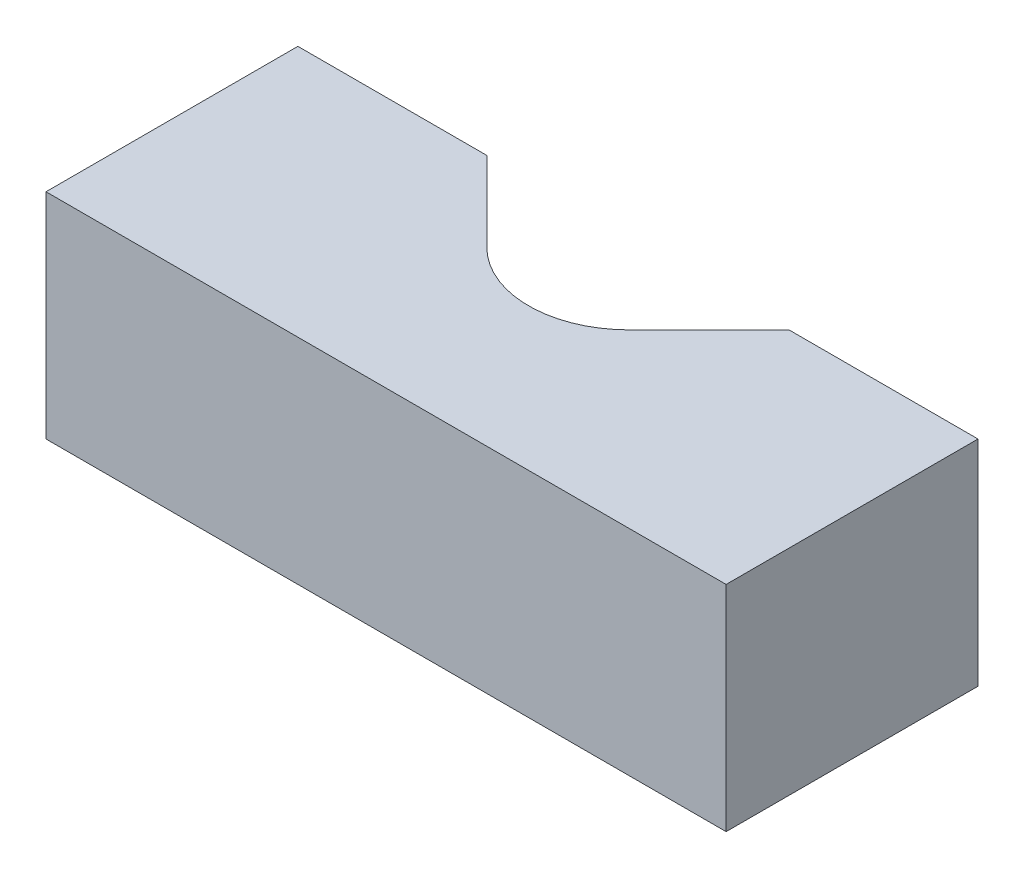
ISO-10303-21;
HEADER;
FILE_DESCRIPTION(('STEP AP214'),'2;1');
FILE_NAME('part.step','',(''),(''),'','','');
FILE_SCHEMA(('AUTOMOTIVE_DESIGN { 1 0 10303 214 1 1 1 1 }'));
ENDSEC;
DATA;
#1=APPLICATION_CONTEXT('core data for automotive mechanical design processes');
#2=APPLICATION_PROTOCOL_DEFINITION('international standard','automotive_design',2000,#1);
#3=PRODUCT_CONTEXT('',#1,'mechanical');
#4=PRODUCT('Part','Part','',(#3));
#5=PRODUCT_RELATED_PRODUCT_CATEGORY('part','',(#4));
#6=PRODUCT_DEFINITION_FORMATION('','',#4);
#7=PRODUCT_DEFINITION_CONTEXT('part definition',#1,'design');
#8=PRODUCT_DEFINITION('design','',#6,#7);
#9=PRODUCT_DEFINITION_SHAPE('','',#8);
#10=(LENGTH_UNIT() NAMED_UNIT(*) SI_UNIT(.MILLI.,.METRE.));
#11=(NAMED_UNIT(*) PLANE_ANGLE_UNIT() SI_UNIT($,.RADIAN.));
#12=(NAMED_UNIT(*) SI_UNIT($,.STERADIAN.) SOLID_ANGLE_UNIT());
#13=UNCERTAINTY_MEASURE_WITH_UNIT(LENGTH_MEASURE(1.E-05),#10,'distance_accuracy_value','');
#14=(GEOMETRIC_REPRESENTATION_CONTEXT(3) GLOBAL_UNCERTAINTY_ASSIGNED_CONTEXT((#13)) GLOBAL_UNIT_ASSIGNED_CONTEXT((#10,
#11,#12)) REPRESENTATION_CONTEXT('',''));
#15=CARTESIAN_POINT('',(0.,0.,0.));
#16=DIRECTION('',(0.,0.,1.));
#17=DIRECTION('',(1.,0.,0.));
#18=AXIS2_PLACEMENT_3D('',#15,#16,#17);
#19=CARTESIAN_POINT('',(7.6179007312484,10.795,1.524));
#20=DIRECTION('',(0.,0.,1.));
#21=DIRECTION('',(1.,0.,0.));
#22=AXIS2_PLACEMENT_3D('',#19,#20,#21);
#23=PLANE('',#22);
#24=DIRECTION('',(-1.,0.,0.));
#25=VECTOR('',#24,1.);
#26=CARTESIAN_POINT('',(7.6179007312484,0.,1.524));
#27=LINE('',#26,#25);
#28=CARTESIAN_POINT('',(17.1429007312484,0.,1.524));
#29=VERTEX_POINT('',#28);
#30=CARTESIAN_POINT('',(7.6179007312484,0.,1.524));
#31=VERTEX_POINT('',#30);
#32=EDGE_CURVE('E119',#29,#31,#27,.T.);
#33=ORIENTED_EDGE('',*,*,#32,.T.);
#34=DIRECTION('',(0.,-1.,0.));
#35=VECTOR('',#34,1.);
#36=CARTESIAN_POINT('',(7.6179007312484,10.795,1.524));
#37=LINE('',#36,#35);
#38=CARTESIAN_POINT('',(7.6179007312484,10.795,1.524));
#39=VERTEX_POINT('',#38);
#40=EDGE_CURVE('E102',#39,#31,#37,.T.);
#41=ORIENTED_EDGE('',*,*,#40,.F.);
#42=DIRECTION('',(-1.,0.,0.));
#43=VECTOR('',#42,1.);
#44=CARTESIAN_POINT('',(7.6179007312484,10.795,1.524));
#45=LINE('',#44,#43);
#46=CARTESIAN_POINT('',(17.1429007312484,10.795,1.524));
#47=VERTEX_POINT('',#46);
#48=EDGE_CURVE('E107',#47,#39,#45,.T.);
#49=ORIENTED_EDGE('',*,*,#48,.F.);
#50=DIRECTION('',(0.,-1.,0.));
#51=VECTOR('',#50,1.);
#52=CARTESIAN_POINT('',(17.1429007312484,10.795,1.524));
#53=LINE('',#52,#51);
#54=EDGE_CURVE('E138',#47,#29,#53,.T.);
#55=ORIENTED_EDGE('',*,*,#54,.T.);
#56=EDGE_LOOP('',(#33,#41,#49,#55));
#57=FACE_BOUND('',#56,.T.);
#58=ADVANCED_FACE('F37',(#57),#23,.F.);
#59=CARTESIAN_POINT('',(7.6179007312484,10.795,1.524));
#60=DIRECTION('',(0.707106781186548,0.,0.707106781186547));
#61=DIRECTION('',(0.707106781186547,0.,-0.707106781186548));
#62=AXIS2_PLACEMENT_3D('',#59,#60,#61);
#63=PLANE('',#62);
#64=DIRECTION('',(-0.707106781186547,0.,0.707106781186548));
#65=VECTOR('',#64,1.);
#66=CARTESIAN_POINT('',(7.6179007312484,0.,1.524));
#67=LINE('',#66,#65);
#68=CARTESIAN_POINT('',(3.59210244842766,0.,5.54979828282074));
#69=VERTEX_POINT('',#68);
#70=EDGE_CURVE('E149',#31,#69,#67,.T.);
#71=ORIENTED_EDGE('',*,*,#70,.T.);
#72=DIRECTION('',(0.,-1.,0.));
#73=VECTOR('',#72,1.);
#74=CARTESIAN_POINT('',(3.59210244842766,10.795,5.54979828282074));
#75=LINE('',#74,#73);
#76=CARTESIAN_POINT('',(3.59210244842766,10.795,5.54979828282074));
#77=VERTEX_POINT('',#76);
#78=EDGE_CURVE('E52',#69,#77,#75,.F.);
#79=ORIENTED_EDGE('',*,*,#78,.T.);
#80=DIRECTION('',(-0.707106781186547,0.,0.707106781186548));
#81=VECTOR('',#80,1.);
#82=CARTESIAN_POINT('',(7.6179007312484,10.795,1.524));
#83=LINE('',#82,#81);
#84=EDGE_CURVE('E98',#39,#77,#83,.T.);
#85=ORIENTED_EDGE('',*,*,#84,.F.);
#86=ORIENTED_EDGE('',*,*,#40,.T.);
#87=EDGE_LOOP('',(#71,#79,#85,#86));
#88=FACE_BOUND('',#87,.T.);
#89=ADVANCED_FACE('F100',(#88),#63,.F.);
#90=CARTESIAN_POINT('',(-7.6179007312484,10.795,1.524));
#91=DIRECTION('',(-0.707106781186547,0.,0.707106781186548));
#92=DIRECTION('',(0.707106781186548,0.,0.707106781186547));
#93=AXIS2_PLACEMENT_3D('',#90,#91,#92);
#94=PLANE('',#93);
#95=DIRECTION('',(-0.707106781186548,0.,-0.707106781186547));
#96=VECTOR('',#95,1.);
#97=CARTESIAN_POINT('',(-7.6179007312484,10.795,1.524));
#98=LINE('',#97,#96);
#99=CARTESIAN_POINT('',(-3.59210244842766,10.795,5.54979828282074));
#100=VERTEX_POINT('',#99);
#101=CARTESIAN_POINT('',(-7.6179007312484,10.795,1.524));
#102=VERTEX_POINT('',#101);
#103=EDGE_CURVE('E106',#100,#102,#98,.T.);
#104=ORIENTED_EDGE('',*,*,#103,.F.);
#105=DIRECTION('',(0.,-1.,0.));
#106=VECTOR('',#105,1.);
#107=CARTESIAN_POINT('',(-3.59210244842766,0.,5.54979828282074));
#108=LINE('',#107,#106);
#109=CARTESIAN_POINT('',(-3.59210244842766,0.,5.54979828282074));
#110=VERTEX_POINT('',#109);
#111=EDGE_CURVE('E120',#100,#110,#108,.T.);
#112=ORIENTED_EDGE('',*,*,#111,.T.);
#113=DIRECTION('',(-0.707106781186548,0.,-0.707106781186547));
#114=VECTOR('',#113,1.);
#115=CARTESIAN_POINT('',(-7.6179007312484,0.,1.524));
#116=LINE('',#115,#114);
#117=CARTESIAN_POINT('',(-7.6179007312484,0.,1.524));
#118=VERTEX_POINT('',#117);
#119=EDGE_CURVE('E147',#110,#118,#116,.T.);
#120=ORIENTED_EDGE('',*,*,#119,.T.);
#121=DIRECTION('',(0.,-1.,0.));
#122=VECTOR('',#121,1.);
#123=CARTESIAN_POINT('',(-7.6179007312484,10.795,1.524));
#124=LINE('',#123,#122);
#125=EDGE_CURVE('E121',#102,#118,#124,.T.);
#126=ORIENTED_EDGE('',*,*,#125,.F.);
#127=EDGE_LOOP('',(#104,#112,#120,#126));
#128=FACE_BOUND('',#127,.T.);
#129=ADVANCED_FACE('F165',(#128),#94,.F.);
#130=CARTESIAN_POINT('',(-7.6179007312484,10.795,1.524));
#131=DIRECTION('',(0.,0.,1.));
#132=DIRECTION('',(1.,0.,0.));
#133=AXIS2_PLACEMENT_3D('',#130,#131,#132);
#134=PLANE('',#133);
#135=DIRECTION('',(-1.,0.,0.));
#136=VECTOR('',#135,1.);
#137=CARTESIAN_POINT('',(-7.6179007312484,0.,1.524));
#138=LINE('',#137,#136);
#139=CARTESIAN_POINT('',(-17.1429007312484,0.,1.524));
#140=VERTEX_POINT('',#139);
#141=EDGE_CURVE('E145',#118,#140,#138,.T.);
#142=ORIENTED_EDGE('',*,*,#141,.T.);
#143=DIRECTION('',(0.,-1.,0.));
#144=VECTOR('',#143,1.);
#145=CARTESIAN_POINT('',(-17.1429007312484,10.795,1.524));
#146=LINE('',#145,#144);
#147=CARTESIAN_POINT('',(-17.1429007312484,10.795,1.524));
#148=VERTEX_POINT('',#147);
#149=EDGE_CURVE('E126',#148,#140,#146,.T.);
#150=ORIENTED_EDGE('',*,*,#149,.F.);
#151=DIRECTION('',(-1.,0.,0.));
#152=VECTOR('',#151,1.);
#153=CARTESIAN_POINT('',(-7.6179007312484,10.795,1.524));
#154=LINE('',#153,#152);
#155=EDGE_CURVE('E157',#102,#148,#154,.T.);
#156=ORIENTED_EDGE('',*,*,#155,.F.);
#157=ORIENTED_EDGE('',*,*,#125,.T.);
#158=EDGE_LOOP('',(#142,#150,#156,#157));
#159=FACE_BOUND('',#158,.T.);
#160=ADVANCED_FACE('F168',(#159),#134,.F.);
#161=CARTESIAN_POINT('',(-17.1429007312484,10.795,1.524));
#162=DIRECTION('',(1.,0.,0.));
#163=DIRECTION('',(0.,0.,-1.));
#164=AXIS2_PLACEMENT_3D('',#161,#162,#163);
#165=PLANE('',#164);
#166=DIRECTION('',(0.,0.,1.));
#167=VECTOR('',#166,1.);
#168=CARTESIAN_POINT('',(-17.1429007312484,0.,1.524));
#169=LINE('',#168,#167);
#170=CARTESIAN_POINT('',(-17.1429007312484,0.,14.2219007312484));
#171=VERTEX_POINT('',#170);
#172=EDGE_CURVE('E143',#140,#171,#169,.T.);
#173=ORIENTED_EDGE('',*,*,#172,.T.);
#174=DIRECTION('',(0.,-1.,0.));
#175=VECTOR('',#174,1.);
#176=CARTESIAN_POINT('',(-17.1429007312484,10.795,14.2219007312484));
#177=LINE('',#176,#175);
#178=CARTESIAN_POINT('',(-17.1429007312484,10.795,14.2219007312484));
#179=VERTEX_POINT('',#178);
#180=EDGE_CURVE('E132',#179,#171,#177,.T.);
#181=ORIENTED_EDGE('',*,*,#180,.F.);
#182=DIRECTION('',(0.,0.,1.));
#183=VECTOR('',#182,1.);
#184=CARTESIAN_POINT('',(-17.1429007312484,10.795,1.524));
#185=LINE('',#184,#183);
#186=EDGE_CURVE('E155',#148,#179,#185,.T.);
#187=ORIENTED_EDGE('',*,*,#186,.F.);
#188=ORIENTED_EDGE('',*,*,#149,.T.);
#189=EDGE_LOOP('',(#173,#181,#187,#188));
#190=FACE_BOUND('',#189,.T.);
#191=ADVANCED_FACE('F173',(#190),#165,.F.);
#192=CARTESIAN_POINT('',(-17.1429007312484,10.795,14.2219007312484));
#193=DIRECTION('',(0.,0.,-1.));
#194=DIRECTION('',(-1.,0.,0.));
#195=AXIS2_PLACEMENT_3D('',#192,#193,#194);
#196=PLANE('',#195);
#197=DIRECTION('',(1.,0.,0.));
#198=VECTOR('',#197,1.);
#199=CARTESIAN_POINT('',(-17.1429007312484,0.,14.2219007312484));
#200=LINE('',#199,#198);
#201=CARTESIAN_POINT('',(17.1429007312484,0.,14.2219007312484));
#202=VERTEX_POINT('',#201);
#203=EDGE_CURVE('E141',#171,#202,#200,.T.);
#204=ORIENTED_EDGE('',*,*,#203,.T.);
#205=DIRECTION('',(0.,-1.,0.));
#206=VECTOR('',#205,1.);
#207=CARTESIAN_POINT('',(17.1429007312484,10.795,14.2219007312484));
#208=LINE('',#207,#206);
#209=CARTESIAN_POINT('',(17.1429007312484,10.795,14.2219007312484));
#210=VERTEX_POINT('',#209);
#211=EDGE_CURVE('E135',#210,#202,#208,.T.);
#212=ORIENTED_EDGE('',*,*,#211,.F.);
#213=DIRECTION('',(1.,0.,0.));
#214=VECTOR('',#213,1.);
#215=CARTESIAN_POINT('',(-17.1429007312484,10.795,14.2219007312484));
#216=LINE('',#215,#214);
#217=EDGE_CURVE('E153',#179,#210,#216,.T.);
#218=ORIENTED_EDGE('',*,*,#217,.F.);
#219=ORIENTED_EDGE('',*,*,#180,.T.);
#220=EDGE_LOOP('',(#204,#212,#218,#219));
#221=FACE_BOUND('',#220,.T.);
#222=ADVANCED_FACE('F177',(#221),#196,.F.);
#223=CARTESIAN_POINT('',(17.1429007312484,10.795,1.524));
#224=DIRECTION('',(-1.,0.,0.));
#225=DIRECTION('',(0.,0.,1.));
#226=AXIS2_PLACEMENT_3D('',#223,#224,#225);
#227=PLANE('',#226);
#228=DIRECTION('',(0.,0.,-1.));
#229=VECTOR('',#228,1.);
#230=CARTESIAN_POINT('',(17.1429007312484,0.,1.524));
#231=LINE('',#230,#229);
#232=EDGE_CURVE('E116',#202,#29,#231,.T.);
#233=ORIENTED_EDGE('',*,*,#232,.T.);
#234=ORIENTED_EDGE('',*,*,#54,.F.);
#235=DIRECTION('',(0.,0.,-1.));
#236=VECTOR('',#235,1.);
#237=CARTESIAN_POINT('',(17.1429007312484,10.795,1.524));
#238=LINE('',#237,#236);
#239=EDGE_CURVE('E112',#210,#47,#238,.T.);
#240=ORIENTED_EDGE('',*,*,#239,.F.);
#241=ORIENTED_EDGE('',*,*,#211,.T.);
#242=EDGE_LOOP('',(#233,#234,#240,#241));
#243=FACE_BOUND('',#242,.T.);
#244=ADVANCED_FACE('F181',(#243),#227,.F.);
#245=CARTESIAN_POINT('',(0.,10.795,0.));
#246=DIRECTION('',(0.,-1.,0.));
#247=DIRECTION('',(0.,0.,-1.));
#248=AXIS2_PLACEMENT_3D('',#245,#246,#247);
#249=PLANE('',#248);
#250=ORIENTED_EDGE('',*,*,#48,.T.);
#251=ORIENTED_EDGE('',*,*,#84,.T.);
#252=CARTESIAN_POINT('',(0.,10.795,1.95769583439308));
#253=DIRECTION('',(0.,-1.,0.));
#254=DIRECTION('',(0.,0.,-1.));
#255=AXIS2_PLACEMENT_3D('',#252,#253,#254);
#256=CIRCLE('',#255,5.08);
#257=EDGE_CURVE('E11',#77,#100,#256,.T.);
#258=ORIENTED_EDGE('',*,*,#257,.T.);
#259=ORIENTED_EDGE('',*,*,#103,.T.);
#260=ORIENTED_EDGE('',*,*,#155,.T.);
#261=ORIENTED_EDGE('',*,*,#186,.T.);
#262=ORIENTED_EDGE('',*,*,#217,.T.);
#263=ORIENTED_EDGE('',*,*,#239,.T.);
#264=EDGE_LOOP('',(#250,#251,#258,#259,#260,#261,#262,#263));
#265=FACE_BOUND('',#264,.T.);
#266=ADVANCED_FACE('F110',(#265),#249,.F.);
#267=CARTESIAN_POINT('',(0.,0.,0.));
#268=DIRECTION('',(0.,-1.,0.));
#269=DIRECTION('',(0.,0.,-1.));
#270=AXIS2_PLACEMENT_3D('',#267,#268,#269);
#271=PLANE('',#270);
#272=ORIENTED_EDGE('',*,*,#32,.F.);
#273=ORIENTED_EDGE('',*,*,#232,.F.);
#274=ORIENTED_EDGE('',*,*,#203,.F.);
#275=ORIENTED_EDGE('',*,*,#172,.F.);
#276=ORIENTED_EDGE('',*,*,#141,.F.);
#277=ORIENTED_EDGE('',*,*,#119,.F.);
#278=CARTESIAN_POINT('',(0.,0.,1.95769583439308));
#279=DIRECTION('',(0.,-1.,0.));
#280=DIRECTION('',(0.,0.,-1.));
#281=AXIS2_PLACEMENT_3D('',#278,#279,#280);
#282=CIRCLE('',#281,5.08);
#283=EDGE_CURVE('E45',#110,#69,#282,.F.);
#284=ORIENTED_EDGE('',*,*,#283,.T.);
#285=ORIENTED_EDGE('',*,*,#70,.F.);
#286=EDGE_LOOP('',(#272,#273,#274,#275,#276,#277,#284,#285));
#287=FACE_BOUND('',#286,.T.);
#288=ADVANCED_FACE('F182',(#287),#271,.T.);
#289=CARTESIAN_POINT('',(0.,10.795,1.95769583439308));
#290=DIRECTION('',(0.,1.,0.));
#291=DIRECTION('',(0.,0.,1.));
#292=AXIS2_PLACEMENT_3D('',#289,#290,#291);
#293=CYLINDRICAL_SURFACE('',#292,5.08);
#294=ORIENTED_EDGE('',*,*,#257,.F.);
#295=ORIENTED_EDGE('',*,*,#78,.F.);
#296=ORIENTED_EDGE('',*,*,#283,.F.);
#297=ORIENTED_EDGE('',*,*,#111,.F.);
#298=EDGE_LOOP('',(#294,#295,#296,#297));
#299=FACE_BOUND('',#298,.T.);
#300=ADVANCED_FACE('F39',(#299),#293,.F.);
#301=CLOSED_SHELL('',(#58,#89,#129,#160,#191,#222,#244,#266,#288,#300));
#302=MANIFOLD_SOLID_BREP('B2',#301);
#303=ADVANCED_BREP_SHAPE_REPRESENTATION('',(#18,#302),#14);
#304=SHAPE_DEFINITION_REPRESENTATION(#9,#303);
ENDSEC;
END-ISO-10303-21;
